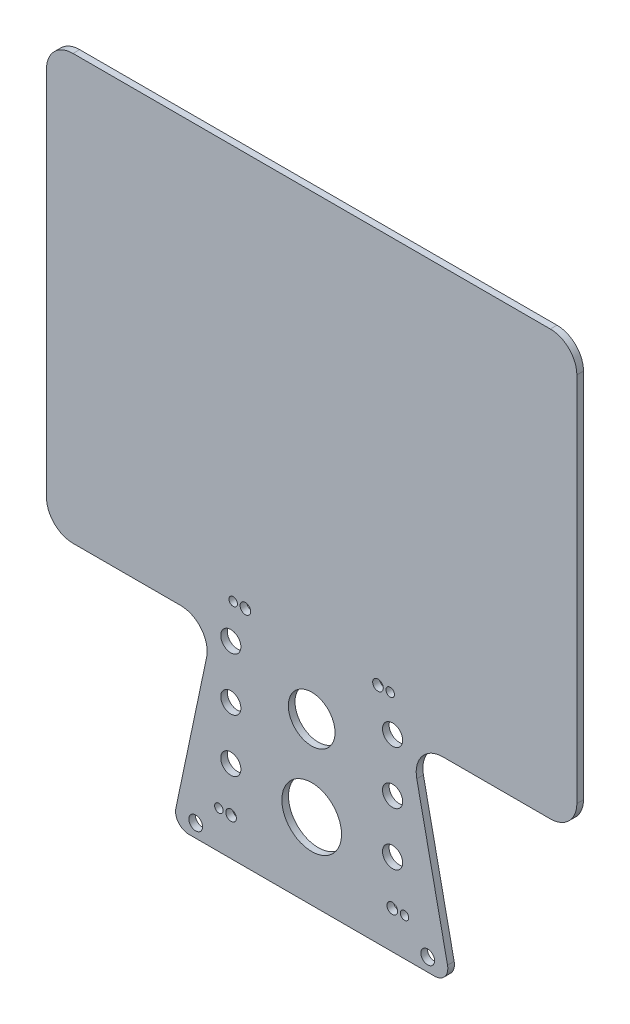
ISO-10303-21;
HEADER;
FILE_DESCRIPTION(('STEP AP214'),'2;1');
FILE_NAME('part.step','',(''),(''),'','','');
FILE_SCHEMA(('AUTOMOTIVE_DESIGN { 1 0 10303 214 1 1 1 1 }'));
ENDSEC;
DATA;
#1=APPLICATION_CONTEXT('core data for automotive mechanical design processes');
#2=APPLICATION_PROTOCOL_DEFINITION('international standard','automotive_design',2000,#1);
#3=PRODUCT_CONTEXT('',#1,'mechanical');
#4=PRODUCT('Part','Part','',(#3));
#5=PRODUCT_RELATED_PRODUCT_CATEGORY('part','',(#4));
#6=PRODUCT_DEFINITION_FORMATION('','',#4);
#7=PRODUCT_DEFINITION_CONTEXT('part definition',#1,'design');
#8=PRODUCT_DEFINITION('design','',#6,#7);
#9=PRODUCT_DEFINITION_SHAPE('','',#8);
#10=(LENGTH_UNIT() NAMED_UNIT(*) SI_UNIT(.MILLI.,.METRE.));
#11=(NAMED_UNIT(*) PLANE_ANGLE_UNIT() SI_UNIT($,.RADIAN.));
#12=(NAMED_UNIT(*) SI_UNIT($,.STERADIAN.) SOLID_ANGLE_UNIT());
#13=UNCERTAINTY_MEASURE_WITH_UNIT(LENGTH_MEASURE(1.E-05),#10,'distance_accuracy_value','');
#14=(GEOMETRIC_REPRESENTATION_CONTEXT(3) GLOBAL_UNCERTAINTY_ASSIGNED_CONTEXT((#13)) GLOBAL_UNIT_ASSIGNED_CONTEXT((#10,
#11,#12)) REPRESENTATION_CONTEXT('',''));
#15=CARTESIAN_POINT('',(0.,0.,0.));
#16=DIRECTION('',(0.,0.,1.));
#17=DIRECTION('',(1.,0.,0.));
#18=AXIS2_PLACEMENT_3D('',#15,#16,#17);
#19=CARTESIAN_POINT('',(25.4,-120.65,3.175));
#20=DIRECTION('',(-0.978549784986749,-0.206010481049842,0.));
#21=DIRECTION('',(0.206010481049842,-0.978549784986749,0.));
#22=AXIS2_PLACEMENT_3D('',#19,#20,#21);
#23=PLANE('',#22);
#24=DIRECTION('',(-0.206010481049842,0.978549784986749,0.));
#25=VECTOR('',#24,1.);
#26=CARTESIAN_POINT('',(25.4,-120.65,0.));
#27=LINE('',#26,#25);
#28=CARTESIAN_POINT('',(23.7877544095439,-112.991833445334,0.));
#29=VERTEX_POINT('',#28);
#30=CARTESIAN_POINT('',(9.05312275985957,-43.002333109333,0.));
#31=VERTEX_POINT('',#30);
#32=EDGE_CURVE('E163',#29,#31,#27,.T.);
#33=ORIENTED_EDGE('',*,*,#32,.T.);
#34=DIRECTION('',(0.,0.,1.));
#35=VECTOR('',#34,1.);
#36=CARTESIAN_POINT('',(9.05312275985957,-43.002333109333,3.175));
#37=LINE('',#36,#35);
#38=CARTESIAN_POINT('',(9.05312275985957,-43.002333109333,3.175));
#39=VERTEX_POINT('',#38);
#40=EDGE_CURVE('E198',#31,#39,#37,.T.);
#41=ORIENTED_EDGE('',*,*,#40,.T.);
#42=DIRECTION('',(-0.206010481049842,0.978549784986749,0.));
#43=VECTOR('',#42,1.);
#44=CARTESIAN_POINT('',(25.4,-120.65,3.175));
#45=LINE('',#44,#43);
#46=CARTESIAN_POINT('',(23.7877544095439,-112.991833445334,3.175));
#47=VERTEX_POINT('',#46);
#48=EDGE_CURVE('E166',#47,#39,#45,.T.);
#49=ORIENTED_EDGE('',*,*,#48,.F.);
#50=DIRECTION('',(0.,0.,-1.));
#51=VECTOR('',#50,1.);
#52=CARTESIAN_POINT('',(23.7877544095439,-112.991833445334,3.175));
#53=LINE('',#52,#51);
#54=EDGE_CURVE('E151',#47,#29,#53,.T.);
#55=ORIENTED_EDGE('',*,*,#54,.T.);
#56=EDGE_LOOP('',(#33,#41,#49,#55));
#57=FACE_BOUND('',#56,.T.);
#58=ADVANCED_FACE('F33',(#57),#23,.F.);
#59=CARTESIAN_POINT('',(-82.55,0.,3.175));
#60=DIRECTION('',(0.978549784986749,-0.206010481049842,0.));
#61=DIRECTION('',(0.206010481049842,0.978549784986749,0.));
#62=AXIS2_PLACEMENT_3D('',#59,#60,#61);
#63=PLANE('',#62);
#64=DIRECTION('',(-0.206010481049842,-0.978549784986749,0.));
#65=VECTOR('',#64,1.);
#66=CARTESIAN_POINT('',(-82.55,0.,3.175));
#67=LINE('',#66,#65);
#68=CARTESIAN_POINT('',(-91.6031227598596,-43.002333109333,3.175));
#69=VERTEX_POINT('',#68);
#70=CARTESIAN_POINT('',(-106.337754409544,-112.991833445334,3.175));
#71=VERTEX_POINT('',#70);
#72=EDGE_CURVE('E376',#69,#71,#67,.T.);
#73=ORIENTED_EDGE('',*,*,#72,.F.);
#74=DIRECTION('',(0.,0.,1.));
#75=VECTOR('',#74,1.);
#76=CARTESIAN_POINT('',(-91.6031227598596,-43.002333109333,3.175));
#77=LINE('',#76,#75);
#78=CARTESIAN_POINT('',(-91.6031227598596,-43.002333109333,0.));
#79=VERTEX_POINT('',#78);
#80=EDGE_CURVE('E206',#69,#79,#77,.F.);
#81=ORIENTED_EDGE('',*,*,#80,.T.);
#82=DIRECTION('',(-0.206010481049842,-0.978549784986749,0.));
#83=VECTOR('',#82,1.);
#84=CARTESIAN_POINT('',(-82.55,0.,0.));
#85=LINE('',#84,#83);
#86=CARTESIAN_POINT('',(-106.337754409544,-112.991833445334,0.));
#87=VERTEX_POINT('',#86);
#88=EDGE_CURVE('E174',#79,#87,#85,.T.);
#89=ORIENTED_EDGE('',*,*,#88,.T.);
#90=DIRECTION('',(0.,0.,-1.));
#91=VECTOR('',#90,1.);
#92=CARTESIAN_POINT('',(-106.337754409544,-112.991833445334,3.175));
#93=LINE('',#92,#91);
#94=EDGE_CURVE('E195',#87,#71,#93,.F.);
#95=ORIENTED_EDGE('',*,*,#94,.T.);
#96=EDGE_LOOP('',(#73,#81,#89,#95));
#97=FACE_BOUND('',#96,.T.);
#98=ADVANCED_FACE('F425',(#97),#63,.F.);
#99=CARTESIAN_POINT('',(-107.95,-120.65,3.175));
#100=DIRECTION('',(0.,1.,0.));
#101=DIRECTION('',(0.,0.,1.));
#102=AXIS2_PLACEMENT_3D('',#99,#100,#101);
#103=PLANE('',#102);
#104=DIRECTION('',(1.,0.,0.));
#105=VECTOR('',#104,1.);
#106=CARTESIAN_POINT('',(-107.95,-120.65,0.));
#107=LINE('',#106,#105);
#108=CARTESIAN_POINT('',(-100.123963274878,-120.65,0.));
#109=VERTEX_POINT('',#108);
#110=CARTESIAN_POINT('',(17.573963274878,-120.65,0.));
#111=VERTEX_POINT('',#110);
#112=EDGE_CURVE('E177',#109,#111,#107,.T.);
#113=ORIENTED_EDGE('',*,*,#112,.T.);
#114=DIRECTION('',(0.,0.,-1.));
#115=VECTOR('',#114,1.);
#116=CARTESIAN_POINT('',(17.573963274878,-120.65,3.175));
#117=LINE('',#116,#115);
#118=CARTESIAN_POINT('',(17.573963274878,-120.65,3.175));
#119=VERTEX_POINT('',#118);
#120=EDGE_CURVE('E152',#111,#119,#117,.F.);
#121=ORIENTED_EDGE('',*,*,#120,.T.);
#122=DIRECTION('',(1.,0.,0.));
#123=VECTOR('',#122,1.);
#124=CARTESIAN_POINT('',(-107.95,-120.65,3.175));
#125=LINE('',#124,#123);
#126=CARTESIAN_POINT('',(-100.123963274878,-120.65,3.175));
#127=VERTEX_POINT('',#126);
#128=EDGE_CURVE('E167',#127,#119,#125,.T.);
#129=ORIENTED_EDGE('',*,*,#128,.F.);
#130=DIRECTION('',(0.,0.,-1.));
#131=VECTOR('',#130,1.);
#132=CARTESIAN_POINT('',(-100.123963274878,-120.65,3.175));
#133=LINE('',#132,#131);
#134=EDGE_CURVE('E156',#127,#109,#133,.T.);
#135=ORIENTED_EDGE('',*,*,#134,.T.);
#136=EDGE_LOOP('',(#113,#121,#129,#135));
#137=FACE_BOUND('',#136,.T.);
#138=ADVANCED_FACE('F383',(#137),#103,.F.);
#139=CARTESIAN_POINT('',(0.,0.,3.175));
#140=DIRECTION('',(0.,0.,1.));
#141=DIRECTION('',(1.,0.,0.));
#142=AXIS2_PLACEMENT_3D('',#139,#140,#141);
#143=PLANE('',#142);
#144=DIRECTION('',(-1.,0.,0.));
#145=VECTOR('',#144,1.);
#146=CARTESIAN_POINT('',(-168.275,175.514,3.175));
#147=LINE('',#146,#145);
#148=CARTESIAN_POINT('',(73.0249999999999,175.514,3.175));
#149=VERTEX_POINT('',#148);
#150=CARTESIAN_POINT('',(-155.575,175.514,3.175));
#151=VERTEX_POINT('',#150);
#152=EDGE_CURVE('E260',#149,#151,#147,.T.);
#153=ORIENTED_EDGE('',*,*,#152,.T.);
#154=CARTESIAN_POINT('',(-155.575,162.814,3.17499999999998));
#155=DIRECTION('',(0.,0.,1.));
#156=DIRECTION('',(1.,0.,0.));
#157=AXIS2_PLACEMENT_3D('',#154,#155,#156);
#158=CIRCLE('',#157,12.7);
#159=CARTESIAN_POINT('',(-168.275,162.814,3.175));
#160=VERTEX_POINT('',#159);
#161=EDGE_CURVE('E226',#151,#160,#158,.T.);
#162=ORIENTED_EDGE('',*,*,#161,.T.);
#163=DIRECTION('',(0.,-1.,0.));
#164=VECTOR('',#163,1.);
#165=CARTESIAN_POINT('',(-168.275,-27.686,3.175));
#166=LINE('',#165,#164);
#167=CARTESIAN_POINT('',(-168.275,-14.986,3.175));
#168=VERTEX_POINT('',#167);
#169=EDGE_CURVE('E267',#160,#168,#166,.T.);
#170=ORIENTED_EDGE('',*,*,#169,.T.);
#171=CARTESIAN_POINT('',(-155.575,-14.986,3.17499999999998));
#172=DIRECTION('',(0.,0.,1.));
#173=DIRECTION('',(1.,0.,0.));
#174=AXIS2_PLACEMENT_3D('',#171,#172,#173);
#175=CIRCLE('',#174,12.7);
#176=CARTESIAN_POINT('',(-155.575,-27.686,3.175));
#177=VERTEX_POINT('',#176);
#178=EDGE_CURVE('E220',#168,#177,#175,.T.);
#179=ORIENTED_EDGE('',*,*,#178,.T.);
#180=DIRECTION('',(1.,0.,0.));
#181=VECTOR('',#180,1.);
#182=CARTESIAN_POINT('',(-88.3786315789474,-27.686,3.175));
#183=LINE('',#182,#181);
#184=CARTESIAN_POINT('',(-104.030705029191,-27.686,3.175));
#185=VERTEX_POINT('',#184);
#186=EDGE_CURVE('E270',#177,#185,#183,.T.);
#187=ORIENTED_EDGE('',*,*,#186,.T.);
#188=CARTESIAN_POINT('',(-104.030705029191,-40.386,3.17499999999998));
#189=DIRECTION('',(0.,0.,1.));
#190=DIRECTION('',(1.,0.,0.));
#191=AXIS2_PLACEMENT_3D('',#188,#189,#190);
#192=CIRCLE('',#191,12.7);
#193=EDGE_CURVE('E211',#185,#69,#192,.F.);
#194=ORIENTED_EDGE('',*,*,#193,.T.);
#195=ORIENTED_EDGE('',*,*,#72,.T.);
#196=CARTESIAN_POINT('',(-100.123963274878,-114.3,3.175));
#197=DIRECTION('',(0.,0.,1.));
#198=DIRECTION('',(1.,0.,0.));
#199=AXIS2_PLACEMENT_3D('',#196,#197,#198);
#200=CIRCLE('',#199,6.35);
#201=EDGE_CURVE('E191',#71,#127,#200,.T.);
#202=ORIENTED_EDGE('',*,*,#201,.T.);
#203=ORIENTED_EDGE('',*,*,#128,.T.);
#204=CARTESIAN_POINT('',(17.573963274878,-114.3,3.175));
#205=DIRECTION('',(0.,0.,1.));
#206=DIRECTION('',(1.,0.,0.));
#207=AXIS2_PLACEMENT_3D('',#204,#205,#206);
#208=CIRCLE('',#207,6.35);
#209=EDGE_CURVE('E193',#119,#47,#208,.T.);
#210=ORIENTED_EDGE('',*,*,#209,.T.);
#211=ORIENTED_EDGE('',*,*,#48,.T.);
#212=CARTESIAN_POINT('',(21.4807050291913,-40.386,3.175));
#213=DIRECTION('',(0.,0.,1.));
#214=DIRECTION('',(1.,0.,0.));
#215=AXIS2_PLACEMENT_3D('',#212,#213,#214);
#216=CIRCLE('',#215,12.7);
#217=CARTESIAN_POINT('',(21.4807050291913,-27.686,3.175));
#218=VERTEX_POINT('',#217);
#219=EDGE_CURVE('E208',#39,#218,#216,.F.);
#220=ORIENTED_EDGE('',*,*,#219,.T.);
#221=DIRECTION('',(1.,0.,0.));
#222=VECTOR('',#221,1.);
#223=CARTESIAN_POINT('',(5.82863157894736,-27.686,3.175));
#224=LINE('',#223,#222);
#225=CARTESIAN_POINT('',(73.025,-27.686,3.175));
#226=VERTEX_POINT('',#225);
#227=EDGE_CURVE('E249',#218,#226,#224,.T.);
#228=ORIENTED_EDGE('',*,*,#227,.T.);
#229=CARTESIAN_POINT('',(73.025,-14.986,3.17499999999998));
#230=DIRECTION('',(0.,0.,1.));
#231=DIRECTION('',(1.,0.,0.));
#232=AXIS2_PLACEMENT_3D('',#229,#230,#231);
#233=CIRCLE('',#232,12.7);
#234=CARTESIAN_POINT('',(85.7250000000001,-14.986,3.175));
#235=VERTEX_POINT('',#234);
#236=EDGE_CURVE('E222',#226,#235,#233,.T.);
#237=ORIENTED_EDGE('',*,*,#236,.T.);
#238=DIRECTION('',(0.,1.,0.));
#239=VECTOR('',#238,1.);
#240=CARTESIAN_POINT('',(85.725,175.514,3.175));
#241=LINE('',#240,#239);
#242=CARTESIAN_POINT('',(85.725,162.814,3.175));
#243=VERTEX_POINT('',#242);
#244=EDGE_CURVE('E258',#235,#243,#241,.T.);
#245=ORIENTED_EDGE('',*,*,#244,.T.);
#246=CARTESIAN_POINT('',(73.025,162.814,3.17499999999998));
#247=DIRECTION('',(0.,0.,1.));
#248=DIRECTION('',(1.,0.,0.));
#249=AXIS2_PLACEMENT_3D('',#246,#247,#248);
#250=CIRCLE('',#249,12.7);
#251=EDGE_CURVE('E224',#243,#149,#250,.T.);
#252=ORIENTED_EDGE('',*,*,#251,.T.);
#253=EDGE_LOOP('',(#153,#162,#170,#179,#187,#194,#195,#202,#203,#210,#211,#220,#228,#237,#245,#252));
#254=FACE_BOUND('',#253,.T.);
#255=CARTESIAN_POINT('',(-2.54,-30.48,3.175));
#256=DIRECTION('',(0.,0.,1.));
#257=DIRECTION('',(1.,0.,0.));
#258=AXIS2_PLACEMENT_3D('',#255,#256,#257);
#259=CIRCLE('',#258,4.826);
#260=CARTESIAN_POINT('',(2.286,-30.48,3.175));
#261=VERTEX_POINT('',#260);
#262=EDGE_CURVE('E276',#261,#261,#259,.T.);
#263=ORIENTED_EDGE('',*,*,#262,.F.);
#264=EDGE_LOOP('',(#263));
#265=FACE_BOUND('',#264,.T.);
#266=CARTESIAN_POINT('',(-2.53999999999999,-55.88,3.175));
#267=DIRECTION('',(0.,0.,1.));
#268=DIRECTION('',(1.,0.,0.));
#269=AXIS2_PLACEMENT_3D('',#266,#267,#268);
#270=CIRCLE('',#269,4.826);
#271=CARTESIAN_POINT('',(2.28600000000001,-55.88,3.175));
#272=VERTEX_POINT('',#271);
#273=EDGE_CURVE('E275',#272,#272,#270,.T.);
#274=ORIENTED_EDGE('',*,*,#273,.F.);
#275=EDGE_LOOP('',(#274));
#276=FACE_BOUND('',#275,.T.);
#277=CARTESIAN_POINT('',(-2.54,-81.28,3.175));
#278=DIRECTION('',(0.,0.,1.));
#279=DIRECTION('',(1.,0.,0.));
#280=AXIS2_PLACEMENT_3D('',#277,#278,#279);
#281=CIRCLE('',#280,4.82599999999999);
#282=CARTESIAN_POINT('',(2.28599999999999,-81.28,3.175));
#283=VERTEX_POINT('',#282);
#284=EDGE_CURVE('E282',#283,#283,#281,.T.);
#285=ORIENTED_EDGE('',*,*,#284,.F.);
#286=EDGE_LOOP('',(#285));
#287=FACE_BOUND('',#286,.T.);
#288=CARTESIAN_POINT('',(-80.01,-81.28,3.175));
#289=DIRECTION('',(0.,0.,1.));
#290=DIRECTION('',(1.,0.,0.));
#291=AXIS2_PLACEMENT_3D('',#288,#289,#290);
#292=CIRCLE('',#291,4.82599999999999);
#293=CARTESIAN_POINT('',(-75.184,-81.28,3.175));
#294=VERTEX_POINT('',#293);
#295=EDGE_CURVE('E288',#294,#294,#292,.T.);
#296=ORIENTED_EDGE('',*,*,#295,.F.);
#297=EDGE_LOOP('',(#296));
#298=FACE_BOUND('',#297,.T.);
#299=CARTESIAN_POINT('',(-80.01,-55.88,3.175));
#300=DIRECTION('',(0.,0.,1.));
#301=DIRECTION('',(1.,0.,0.));
#302=AXIS2_PLACEMENT_3D('',#299,#300,#301);
#303=CIRCLE('',#302,4.826);
#304=CARTESIAN_POINT('',(-75.184,-55.88,3.175));
#305=VERTEX_POINT('',#304);
#306=EDGE_CURVE('E294',#305,#305,#303,.T.);
#307=ORIENTED_EDGE('',*,*,#306,.F.);
#308=EDGE_LOOP('',(#307));
#309=FACE_BOUND('',#308,.T.);
#310=CARTESIAN_POINT('',(-80.01,-30.48,3.175));
#311=DIRECTION('',(0.,0.,1.));
#312=DIRECTION('',(1.,0.,0.));
#313=AXIS2_PLACEMENT_3D('',#310,#311,#312);
#314=CIRCLE('',#313,4.82599999999999);
#315=CARTESIAN_POINT('',(-75.184,-30.48,3.175));
#316=VERTEX_POINT('',#315);
#317=EDGE_CURVE('E300',#316,#316,#314,.T.);
#318=ORIENTED_EDGE('',*,*,#317,.F.);
#319=EDGE_LOOP('',(#318));
#320=FACE_BOUND('',#319,.T.);
#321=CARTESIAN_POINT('',(3.17500000000001,-102.616,3.175));
#322=DIRECTION('',(0.,0.,1.));
#323=DIRECTION('',(1.,0.,0.));
#324=AXIS2_PLACEMENT_3D('',#321,#322,#323);
#325=CIRCLE('',#324,2.03200000000001);
#326=CARTESIAN_POINT('',(5.20700000000002,-102.616,3.175));
#327=VERTEX_POINT('',#326);
#328=EDGE_CURVE('E306',#327,#327,#325,.T.);
#329=ORIENTED_EDGE('',*,*,#328,.F.);
#330=EDGE_LOOP('',(#329));
#331=FACE_BOUND('',#330,.T.);
#332=CARTESIAN_POINT('',(-85.725,-102.616,3.175));
#333=DIRECTION('',(0.,0.,1.));
#334=DIRECTION('',(1.,0.,0.));
#335=AXIS2_PLACEMENT_3D('',#332,#333,#334);
#336=CIRCLE('',#335,2.03200000000001);
#337=CARTESIAN_POINT('',(-83.693,-102.616,3.175));
#338=VERTEX_POINT('',#337);
#339=EDGE_CURVE('E312',#338,#338,#336,.T.);
#340=ORIENTED_EDGE('',*,*,#339,.F.);
#341=EDGE_LOOP('',(#340));
#342=FACE_BOUND('',#341,.T.);
#343=CARTESIAN_POINT('',(-79.883,-102.616,3.175));
#344=DIRECTION('',(0.,0.,1.));
#345=DIRECTION('',(1.,0.,0.));
#346=AXIS2_PLACEMENT_3D('',#343,#344,#345);
#347=CIRCLE('',#346,2.53999999999999);
#348=CARTESIAN_POINT('',(-77.343,-102.616,3.175));
#349=VERTEX_POINT('',#348);
#350=EDGE_CURVE('E318',#349,#349,#347,.T.);
#351=ORIENTED_EDGE('',*,*,#350,.F.);
#352=EDGE_LOOP('',(#351));
#353=FACE_BOUND('',#352,.T.);
#354=CARTESIAN_POINT('',(-2.66699999999999,-102.616,3.175));
#355=DIRECTION('',(0.,0.,1.));
#356=DIRECTION('',(1.,0.,0.));
#357=AXIS2_PLACEMENT_3D('',#354,#355,#356);
#358=CIRCLE('',#357,2.54);
#359=CARTESIAN_POINT('',(-0.126999999999993,-102.616,3.175));
#360=VERTEX_POINT('',#359);
#361=EDGE_CURVE('E324',#360,#360,#358,.T.);
#362=ORIENTED_EDGE('',*,*,#361,.F.);
#363=EDGE_LOOP('',(#362));
#364=FACE_BOUND('',#363,.T.);
#365=CARTESIAN_POINT('',(-41.275,-43.434,3.175));
#366=DIRECTION('',(0.,0.,1.));
#367=DIRECTION('',(1.,0.,0.));
#368=AXIS2_PLACEMENT_3D('',#365,#366,#367);
#369=CIRCLE('',#368,11.176);
#370=CARTESIAN_POINT('',(-30.099,-43.434,3.175));
#371=VERTEX_POINT('',#370);
#372=EDGE_CURVE('E330',#371,#371,#369,.T.);
#373=ORIENTED_EDGE('',*,*,#372,.F.);
#374=EDGE_LOOP('',(#373));
#375=FACE_BOUND('',#374,.T.);
#376=CARTESIAN_POINT('',(-41.275,-84.074,3.175));
#377=DIRECTION('',(0.,0.,1.));
#378=DIRECTION('',(1.,0.,0.));
#379=AXIS2_PLACEMENT_3D('',#376,#377,#378);
#380=CIRCLE('',#379,14.2875);
#381=CARTESIAN_POINT('',(-26.9875,-84.074,3.175));
#382=VERTEX_POINT('',#381);
#383=EDGE_CURVE('E336',#382,#382,#380,.T.);
#384=ORIENTED_EDGE('',*,*,#383,.F.);
#385=EDGE_LOOP('',(#384));
#386=FACE_BOUND('',#385,.T.);
#387=CARTESIAN_POINT('',(-78.867,-13.462,3.175));
#388=DIRECTION('',(0.,0.,-1.));
#389=DIRECTION('',(-1.,0.,0.));
#390=AXIS2_PLACEMENT_3D('',#387,#388,#389);
#391=CIRCLE('',#390,2.03200000000001);
#392=CARTESIAN_POINT('',(-80.899,-13.462,3.175));
#393=VERTEX_POINT('',#392);
#394=EDGE_CURVE('E345',#393,#393,#391,.T.);
#395=ORIENTED_EDGE('',*,*,#394,.T.);
#396=EDGE_LOOP('',(#395));
#397=FACE_BOUND('',#396,.T.);
#398=CARTESIAN_POINT('',(-3.683,-13.462,3.175));
#399=DIRECTION('',(0.,0.,-1.));
#400=DIRECTION('',(-1.,0.,0.));
#401=AXIS2_PLACEMENT_3D('',#398,#399,#400);
#402=CIRCLE('',#401,2.032);
#403=CARTESIAN_POINT('',(-5.715,-13.462,3.175));
#404=VERTEX_POINT('',#403);
#405=EDGE_CURVE('E351',#404,#404,#402,.T.);
#406=ORIENTED_EDGE('',*,*,#405,.T.);
#407=EDGE_LOOP('',(#406));
#408=FACE_BOUND('',#407,.T.);
#409=CARTESIAN_POINT('',(-73.025,-13.462,3.175));
#410=DIRECTION('',(0.,0.,-1.));
#411=DIRECTION('',(-1.,0.,0.));
#412=AXIS2_PLACEMENT_3D('',#409,#410,#411);
#413=CIRCLE('',#412,2.54);
#414=CARTESIAN_POINT('',(-75.565,-13.462,3.175));
#415=VERTEX_POINT('',#414);
#416=EDGE_CURVE('E357',#415,#415,#413,.T.);
#417=ORIENTED_EDGE('',*,*,#416,.T.);
#418=EDGE_LOOP('',(#417));
#419=FACE_BOUND('',#418,.T.);
#420=CARTESIAN_POINT('',(-9.525,-13.462,3.175));
#421=DIRECTION('',(0.,0.,-1.));
#422=DIRECTION('',(-1.,0.,0.));
#423=AXIS2_PLACEMENT_3D('',#420,#421,#422);
#424=CIRCLE('',#423,2.54);
#425=CARTESIAN_POINT('',(-12.065,-13.462,3.175));
#426=VERTEX_POINT('',#425);
#427=EDGE_CURVE('E363',#426,#426,#424,.T.);
#428=ORIENTED_EDGE('',*,*,#427,.T.);
#429=EDGE_LOOP('',(#428));
#430=FACE_BOUND('',#429,.T.);
#431=CARTESIAN_POINT('',(-96.8375,-114.3,3.175));
#432=DIRECTION('',(0.,0.,-1.));
#433=DIRECTION('',(-1.,0.,0.));
#434=AXIS2_PLACEMENT_3D('',#431,#432,#433);
#435=CIRCLE('',#434,3.302);
#436=CARTESIAN_POINT('',(-100.1395,-114.3,3.175));
#437=VERTEX_POINT('',#436);
#438=EDGE_CURVE('E369',#437,#437,#435,.T.);
#439=ORIENTED_EDGE('',*,*,#438,.T.);
#440=EDGE_LOOP('',(#439));
#441=FACE_BOUND('',#440,.T.);
#442=CARTESIAN_POINT('',(14.2875,-114.3,3.175));
#443=DIRECTION('',(0.,0.,-1.));
#444=DIRECTION('',(-1.,0.,0.));
#445=AXIS2_PLACEMENT_3D('',#442,#443,#444);
#446=CIRCLE('',#445,3.302);
#447=CARTESIAN_POINT('',(10.9855,-114.3,3.175));
#448=VERTEX_POINT('',#447);
#449=EDGE_CURVE('E175',#448,#448,#446,.T.);
#450=ORIENTED_EDGE('',*,*,#449,.T.);
#451=EDGE_LOOP('',(#450));
#452=FACE_BOUND('',#451,.T.);
#453=ADVANCED_FACE('F255',(#254,#265,#276,#287,#298,#309,#320,#331,#342,#353,#364,#375,#386,
#397,#408,#419,#430,#441,#452),#143,.T.);
#454=CARTESIAN_POINT('',(0.,0.,0.));
#455=DIRECTION('',(0.,0.,1.));
#456=DIRECTION('',(1.,0.,0.));
#457=AXIS2_PLACEMENT_3D('',#454,#455,#456);
#458=PLANE('',#457);
#459=DIRECTION('',(0.,1.,0.));
#460=VECTOR('',#459,1.);
#461=CARTESIAN_POINT('',(-168.275,-27.686,0.));
#462=LINE('',#461,#460);
#463=CARTESIAN_POINT('',(-168.275,-14.986,0.));
#464=VERTEX_POINT('',#463);
#465=CARTESIAN_POINT('',(-168.275,162.814,0.));
#466=VERTEX_POINT('',#465);
#467=EDGE_CURVE('E402',#464,#466,#462,.T.);
#468=ORIENTED_EDGE('',*,*,#467,.T.);
#469=CARTESIAN_POINT('',(-155.575,162.814,0.));
#470=DIRECTION('',(0.,0.,1.));
#471=DIRECTION('',(1.,0.,0.));
#472=AXIS2_PLACEMENT_3D('',#469,#470,#471);
#473=CIRCLE('',#472,12.7);
#474=CARTESIAN_POINT('',(-155.575,175.514,0.));
#475=VERTEX_POINT('',#474);
#476=EDGE_CURVE('E238',#466,#475,#473,.F.);
#477=ORIENTED_EDGE('',*,*,#476,.T.);
#478=DIRECTION('',(1.,0.,0.));
#479=VECTOR('',#478,1.);
#480=CARTESIAN_POINT('',(-168.275,175.514,0.));
#481=LINE('',#480,#479);
#482=CARTESIAN_POINT('',(73.0249999999999,175.514,0.));
#483=VERTEX_POINT('',#482);
#484=EDGE_CURVE('E403',#475,#483,#481,.T.);
#485=ORIENTED_EDGE('',*,*,#484,.T.);
#486=CARTESIAN_POINT('',(73.025,162.814,0.));
#487=DIRECTION('',(0.,0.,1.));
#488=DIRECTION('',(1.,0.,0.));
#489=AXIS2_PLACEMENT_3D('',#486,#487,#488);
#490=CIRCLE('',#489,12.7);
#491=CARTESIAN_POINT('',(85.725,162.814,0.));
#492=VERTEX_POINT('',#491);
#493=EDGE_CURVE('E236',#483,#492,#490,.F.);
#494=ORIENTED_EDGE('',*,*,#493,.T.);
#495=DIRECTION('',(0.,-1.,0.));
#496=VECTOR('',#495,1.);
#497=CARTESIAN_POINT('',(85.725,175.514,0.));
#498=LINE('',#497,#496);
#499=CARTESIAN_POINT('',(85.7250000000001,-14.986,0.));
#500=VERTEX_POINT('',#499);
#501=EDGE_CURVE('E407',#492,#500,#498,.T.);
#502=ORIENTED_EDGE('',*,*,#501,.T.);
#503=CARTESIAN_POINT('',(73.025,-14.986,0.));
#504=DIRECTION('',(0.,0.,1.));
#505=DIRECTION('',(1.,0.,0.));
#506=AXIS2_PLACEMENT_3D('',#503,#504,#505);
#507=CIRCLE('',#506,12.7);
#508=CARTESIAN_POINT('',(73.025,-27.686,0.));
#509=VERTEX_POINT('',#508);
#510=EDGE_CURVE('E48',#500,#509,#507,.F.);
#511=ORIENTED_EDGE('',*,*,#510,.T.);
#512=DIRECTION('',(-1.,0.,0.));
#513=VECTOR('',#512,1.);
#514=CARTESIAN_POINT('',(5.82863157894736,-27.686,0.));
#515=LINE('',#514,#513);
#516=CARTESIAN_POINT('',(21.4807050291913,-27.686,0.));
#517=VERTEX_POINT('',#516);
#518=EDGE_CURVE('E251',#509,#517,#515,.T.);
#519=ORIENTED_EDGE('',*,*,#518,.T.);
#520=CARTESIAN_POINT('',(21.4807050291913,-40.386,0.));
#521=DIRECTION('',(0.,0.,1.));
#522=DIRECTION('',(1.,0.,0.));
#523=AXIS2_PLACEMENT_3D('',#520,#521,#522);
#524=CIRCLE('',#523,12.7);
#525=EDGE_CURVE('E173',#517,#31,#524,.T.);
#526=ORIENTED_EDGE('',*,*,#525,.T.);
#527=ORIENTED_EDGE('',*,*,#32,.F.);
#528=CARTESIAN_POINT('',(17.573963274878,-114.3,0.));
#529=DIRECTION('',(0.,0.,1.));
#530=DIRECTION('',(1.,0.,0.));
#531=AXIS2_PLACEMENT_3D('',#528,#529,#530);
#532=CIRCLE('',#531,6.35);
#533=EDGE_CURVE('E147',#29,#111,#532,.F.);
#534=ORIENTED_EDGE('',*,*,#533,.T.);
#535=ORIENTED_EDGE('',*,*,#112,.F.);
#536=CARTESIAN_POINT('',(-100.123963274878,-114.3,0.));
#537=DIRECTION('',(0.,0.,1.));
#538=DIRECTION('',(1.,0.,0.));
#539=AXIS2_PLACEMENT_3D('',#536,#537,#538);
#540=CIRCLE('',#539,6.35);
#541=EDGE_CURVE('E157',#109,#87,#540,.F.);
#542=ORIENTED_EDGE('',*,*,#541,.T.);
#543=ORIENTED_EDGE('',*,*,#88,.F.);
#544=CARTESIAN_POINT('',(-104.030705029191,-40.386,0.));
#545=DIRECTION('',(0.,0.,1.));
#546=DIRECTION('',(1.,0.,0.));
#547=AXIS2_PLACEMENT_3D('',#544,#545,#546);
#548=CIRCLE('',#547,12.7);
#549=CARTESIAN_POINT('',(-104.030705029191,-27.686,0.));
#550=VERTEX_POINT('',#549);
#551=EDGE_CURVE('E213',#79,#550,#548,.T.);
#552=ORIENTED_EDGE('',*,*,#551,.T.);
#553=DIRECTION('',(-1.,0.,0.));
#554=VECTOR('',#553,1.);
#555=CARTESIAN_POINT('',(-88.3786315789474,-27.686,0.));
#556=LINE('',#555,#554);
#557=CARTESIAN_POINT('',(-155.575,-27.686,0.));
#558=VERTEX_POINT('',#557);
#559=EDGE_CURVE('E263',#550,#558,#556,.T.);
#560=ORIENTED_EDGE('',*,*,#559,.T.);
#561=CARTESIAN_POINT('',(-155.575,-14.986,0.));
#562=DIRECTION('',(0.,0.,1.));
#563=DIRECTION('',(1.,0.,0.));
#564=AXIS2_PLACEMENT_3D('',#561,#562,#563);
#565=CIRCLE('',#564,12.7);
#566=EDGE_CURVE('E233',#558,#464,#565,.F.);
#567=ORIENTED_EDGE('',*,*,#566,.T.);
#568=EDGE_LOOP('',(#468,#477,#485,#494,#502,#511,#519,#526,#527,#534,#535,#542,#543,#552,#560,#567));
#569=FACE_BOUND('',#568,.T.);
#570=CARTESIAN_POINT('',(-2.54,-30.48,0.));
#571=DIRECTION('',(0.,0.,1.));
#572=DIRECTION('',(1.,0.,0.));
#573=AXIS2_PLACEMENT_3D('',#570,#571,#572);
#574=CIRCLE('',#573,4.826);
#575=CARTESIAN_POINT('',(2.286,-30.48,0.));
#576=VERTEX_POINT('',#575);
#577=EDGE_CURVE('E272',#576,#576,#574,.T.);
#578=ORIENTED_EDGE('',*,*,#577,.T.);
#579=EDGE_LOOP('',(#578));
#580=FACE_BOUND('',#579,.T.);
#581=CARTESIAN_POINT('',(-2.53999999999999,-55.88,0.));
#582=DIRECTION('',(0.,0.,1.));
#583=DIRECTION('',(1.,0.,0.));
#584=AXIS2_PLACEMENT_3D('',#581,#582,#583);
#585=CIRCLE('',#584,4.826);
#586=CARTESIAN_POINT('',(2.28600000000001,-55.88,0.));
#587=VERTEX_POINT('',#586);
#588=EDGE_CURVE('E279',#587,#587,#585,.T.);
#589=ORIENTED_EDGE('',*,*,#588,.T.);
#590=EDGE_LOOP('',(#589));
#591=FACE_BOUND('',#590,.T.);
#592=CARTESIAN_POINT('',(-2.54,-81.28,0.));
#593=DIRECTION('',(0.,0.,1.));
#594=DIRECTION('',(1.,0.,0.));
#595=AXIS2_PLACEMENT_3D('',#592,#593,#594);
#596=CIRCLE('',#595,4.82599999999999);
#597=CARTESIAN_POINT('',(2.28599999999999,-81.28,0.));
#598=VERTEX_POINT('',#597);
#599=EDGE_CURVE('E285',#598,#598,#596,.T.);
#600=ORIENTED_EDGE('',*,*,#599,.T.);
#601=EDGE_LOOP('',(#600));
#602=FACE_BOUND('',#601,.T.);
#603=CARTESIAN_POINT('',(-80.01,-81.28,0.));
#604=DIRECTION('',(0.,0.,1.));
#605=DIRECTION('',(1.,0.,0.));
#606=AXIS2_PLACEMENT_3D('',#603,#604,#605);
#607=CIRCLE('',#606,4.82599999999999);
#608=CARTESIAN_POINT('',(-75.184,-81.28,0.));
#609=VERTEX_POINT('',#608);
#610=EDGE_CURVE('E291',#609,#609,#607,.T.);
#611=ORIENTED_EDGE('',*,*,#610,.T.);
#612=EDGE_LOOP('',(#611));
#613=FACE_BOUND('',#612,.T.);
#614=CARTESIAN_POINT('',(-80.01,-55.88,0.));
#615=DIRECTION('',(0.,0.,1.));
#616=DIRECTION('',(1.,0.,0.));
#617=AXIS2_PLACEMENT_3D('',#614,#615,#616);
#618=CIRCLE('',#617,4.826);
#619=CARTESIAN_POINT('',(-75.184,-55.88,0.));
#620=VERTEX_POINT('',#619);
#621=EDGE_CURVE('E297',#620,#620,#618,.T.);
#622=ORIENTED_EDGE('',*,*,#621,.T.);
#623=EDGE_LOOP('',(#622));
#624=FACE_BOUND('',#623,.T.);
#625=CARTESIAN_POINT('',(-80.01,-30.48,0.));
#626=DIRECTION('',(0.,0.,1.));
#627=DIRECTION('',(1.,0.,0.));
#628=AXIS2_PLACEMENT_3D('',#625,#626,#627);
#629=CIRCLE('',#628,4.82599999999999);
#630=CARTESIAN_POINT('',(-75.184,-30.48,0.));
#631=VERTEX_POINT('',#630);
#632=EDGE_CURVE('E303',#631,#631,#629,.T.);
#633=ORIENTED_EDGE('',*,*,#632,.T.);
#634=EDGE_LOOP('',(#633));
#635=FACE_BOUND('',#634,.T.);
#636=CARTESIAN_POINT('',(3.17500000000001,-102.616,0.));
#637=DIRECTION('',(0.,0.,1.));
#638=DIRECTION('',(1.,0.,0.));
#639=AXIS2_PLACEMENT_3D('',#636,#637,#638);
#640=CIRCLE('',#639,2.03200000000001);
#641=CARTESIAN_POINT('',(5.20700000000002,-102.616,0.));
#642=VERTEX_POINT('',#641);
#643=EDGE_CURVE('E309',#642,#642,#640,.T.);
#644=ORIENTED_EDGE('',*,*,#643,.T.);
#645=EDGE_LOOP('',(#644));
#646=FACE_BOUND('',#645,.T.);
#647=CARTESIAN_POINT('',(-85.725,-102.616,0.));
#648=DIRECTION('',(0.,0.,1.));
#649=DIRECTION('',(1.,0.,0.));
#650=AXIS2_PLACEMENT_3D('',#647,#648,#649);
#651=CIRCLE('',#650,2.03200000000001);
#652=CARTESIAN_POINT('',(-83.693,-102.616,0.));
#653=VERTEX_POINT('',#652);
#654=EDGE_CURVE('E315',#653,#653,#651,.T.);
#655=ORIENTED_EDGE('',*,*,#654,.T.);
#656=EDGE_LOOP('',(#655));
#657=FACE_BOUND('',#656,.T.);
#658=CARTESIAN_POINT('',(-79.883,-102.616,0.));
#659=DIRECTION('',(0.,0.,1.));
#660=DIRECTION('',(1.,0.,0.));
#661=AXIS2_PLACEMENT_3D('',#658,#659,#660);
#662=CIRCLE('',#661,2.53999999999999);
#663=CARTESIAN_POINT('',(-77.343,-102.616,0.));
#664=VERTEX_POINT('',#663);
#665=EDGE_CURVE('E321',#664,#664,#662,.T.);
#666=ORIENTED_EDGE('',*,*,#665,.T.);
#667=EDGE_LOOP('',(#666));
#668=FACE_BOUND('',#667,.T.);
#669=CARTESIAN_POINT('',(-2.66699999999999,-102.616,0.));
#670=DIRECTION('',(0.,0.,1.));
#671=DIRECTION('',(1.,0.,0.));
#672=AXIS2_PLACEMENT_3D('',#669,#670,#671);
#673=CIRCLE('',#672,2.54);
#674=CARTESIAN_POINT('',(-0.126999999999993,-102.616,0.));
#675=VERTEX_POINT('',#674);
#676=EDGE_CURVE('E327',#675,#675,#673,.T.);
#677=ORIENTED_EDGE('',*,*,#676,.T.);
#678=EDGE_LOOP('',(#677));
#679=FACE_BOUND('',#678,.T.);
#680=CARTESIAN_POINT('',(-41.275,-43.434,0.));
#681=DIRECTION('',(0.,0.,1.));
#682=DIRECTION('',(1.,0.,0.));
#683=AXIS2_PLACEMENT_3D('',#680,#681,#682);
#684=CIRCLE('',#683,11.176);
#685=CARTESIAN_POINT('',(-30.099,-43.434,0.));
#686=VERTEX_POINT('',#685);
#687=EDGE_CURVE('E333',#686,#686,#684,.T.);
#688=ORIENTED_EDGE('',*,*,#687,.T.);
#689=EDGE_LOOP('',(#688));
#690=FACE_BOUND('',#689,.T.);
#691=CARTESIAN_POINT('',(-41.275,-84.074,0.));
#692=DIRECTION('',(0.,0.,1.));
#693=DIRECTION('',(1.,0.,0.));
#694=AXIS2_PLACEMENT_3D('',#691,#692,#693);
#695=CIRCLE('',#694,14.2875);
#696=CARTESIAN_POINT('',(-26.9875,-84.074,0.));
#697=VERTEX_POINT('',#696);
#698=EDGE_CURVE('E339',#697,#697,#695,.T.);
#699=ORIENTED_EDGE('',*,*,#698,.T.);
#700=EDGE_LOOP('',(#699));
#701=FACE_BOUND('',#700,.T.);
#702=CARTESIAN_POINT('',(-78.867,-13.462,0.));
#703=DIRECTION('',(0.,0.,-1.));
#704=DIRECTION('',(-1.,0.,0.));
#705=AXIS2_PLACEMENT_3D('',#702,#703,#704);
#706=CIRCLE('',#705,2.03200000000001);
#707=CARTESIAN_POINT('',(-80.899,-13.462,0.));
#708=VERTEX_POINT('',#707);
#709=EDGE_CURVE('E342',#708,#708,#706,.T.);
#710=ORIENTED_EDGE('',*,*,#709,.F.);
#711=EDGE_LOOP('',(#710));
#712=FACE_BOUND('',#711,.T.);
#713=CARTESIAN_POINT('',(-3.683,-13.462,0.));
#714=DIRECTION('',(0.,0.,-1.));
#715=DIRECTION('',(-1.,0.,0.));
#716=AXIS2_PLACEMENT_3D('',#713,#714,#715);
#717=CIRCLE('',#716,2.032);
#718=CARTESIAN_POINT('',(-5.715,-13.462,0.));
#719=VERTEX_POINT('',#718);
#720=EDGE_CURVE('E348',#719,#719,#717,.T.);
#721=ORIENTED_EDGE('',*,*,#720,.F.);
#722=EDGE_LOOP('',(#721));
#723=FACE_BOUND('',#722,.T.);
#724=CARTESIAN_POINT('',(-73.025,-13.462,0.));
#725=DIRECTION('',(0.,0.,-1.));
#726=DIRECTION('',(-1.,0.,0.));
#727=AXIS2_PLACEMENT_3D('',#724,#725,#726);
#728=CIRCLE('',#727,2.54);
#729=CARTESIAN_POINT('',(-75.565,-13.462,0.));
#730=VERTEX_POINT('',#729);
#731=EDGE_CURVE('E354',#730,#730,#728,.T.);
#732=ORIENTED_EDGE('',*,*,#731,.F.);
#733=EDGE_LOOP('',(#732));
#734=FACE_BOUND('',#733,.T.);
#735=CARTESIAN_POINT('',(-9.525,-13.462,0.));
#736=DIRECTION('',(0.,0.,-1.));
#737=DIRECTION('',(-1.,0.,0.));
#738=AXIS2_PLACEMENT_3D('',#735,#736,#737);
#739=CIRCLE('',#738,2.54);
#740=CARTESIAN_POINT('',(-12.065,-13.462,0.));
#741=VERTEX_POINT('',#740);
#742=EDGE_CURVE('E360',#741,#741,#739,.T.);
#743=ORIENTED_EDGE('',*,*,#742,.F.);
#744=EDGE_LOOP('',(#743));
#745=FACE_BOUND('',#744,.T.);
#746=CARTESIAN_POINT('',(-96.8375,-114.3,0.));
#747=DIRECTION('',(0.,0.,-1.));
#748=DIRECTION('',(-1.,0.,0.));
#749=AXIS2_PLACEMENT_3D('',#746,#747,#748);
#750=CIRCLE('',#749,3.302);
#751=CARTESIAN_POINT('',(-100.1395,-114.3,0.));
#752=VERTEX_POINT('',#751);
#753=EDGE_CURVE('E366',#752,#752,#750,.T.);
#754=ORIENTED_EDGE('',*,*,#753,.F.);
#755=EDGE_LOOP('',(#754));
#756=FACE_BOUND('',#755,.T.);
#757=CARTESIAN_POINT('',(14.2875,-114.3,0.));
#758=DIRECTION('',(0.,0.,-1.));
#759=DIRECTION('',(-1.,0.,0.));
#760=AXIS2_PLACEMENT_3D('',#757,#758,#759);
#761=CIRCLE('',#760,3.302);
#762=CARTESIAN_POINT('',(10.9855,-114.3,0.));
#763=VERTEX_POINT('',#762);
#764=EDGE_CURVE('E180',#763,#763,#761,.T.);
#765=ORIENTED_EDGE('',*,*,#764,.F.);
#766=EDGE_LOOP('',(#765));
#767=FACE_BOUND('',#766,.T.);
#768=ADVANCED_FACE('F170',(#569,#580,#591,#602,#613,#624,#635,#646,#657,#668,#679,#690,#701,
#712,#723,#734,#745,#756,#767),#458,.F.);
#769=CARTESIAN_POINT('',(17.573963274878,-114.3,3.175));
#770=DIRECTION('',(0.,0.,-1.));
#771=DIRECTION('',(-1.,0.,0.));
#772=AXIS2_PLACEMENT_3D('',#769,#770,#771);
#773=CYLINDRICAL_SURFACE('',#772,6.35);
#774=ORIENTED_EDGE('',*,*,#209,.F.);
#775=ORIENTED_EDGE('',*,*,#120,.F.);
#776=ORIENTED_EDGE('',*,*,#533,.F.);
#777=ORIENTED_EDGE('',*,*,#54,.F.);
#778=EDGE_LOOP('',(#774,#775,#776,#777));
#779=FACE_BOUND('',#778,.T.);
#780=ADVANCED_FACE('F150',(#779),#773,.T.);
#781=CARTESIAN_POINT('',(-100.123963274878,-114.3,3.175));
#782=DIRECTION('',(0.,0.,-1.));
#783=DIRECTION('',(-1.,0.,0.));
#784=AXIS2_PLACEMENT_3D('',#781,#782,#783);
#785=CYLINDRICAL_SURFACE('',#784,6.35);
#786=ORIENTED_EDGE('',*,*,#201,.F.);
#787=ORIENTED_EDGE('',*,*,#94,.F.);
#788=ORIENTED_EDGE('',*,*,#541,.F.);
#789=ORIENTED_EDGE('',*,*,#134,.F.);
#790=EDGE_LOOP('',(#786,#787,#788,#789));
#791=FACE_BOUND('',#790,.T.);
#792=ADVANCED_FACE('F385',(#791),#785,.T.);
#793=CARTESIAN_POINT('',(14.2875,-114.3,3.175));
#794=DIRECTION('',(0.,0.,-1.));
#795=DIRECTION('',(-1.,0.,0.));
#796=AXIS2_PLACEMENT_3D('',#793,#794,#795);
#797=CYLINDRICAL_SURFACE('',#796,3.302);
#798=ORIENTED_EDGE('',*,*,#449,.F.);
#799=EDGE_LOOP('',(#798));
#800=FACE_BOUND('',#799,.T.);
#801=ORIENTED_EDGE('',*,*,#764,.T.);
#802=EDGE_LOOP('',(#801));
#803=FACE_BOUND('',#802,.T.);
#804=ADVANCED_FACE('F436',(#800,#803),#797,.F.);
#805=CARTESIAN_POINT('',(-96.8375,-114.3,3.175));
#806=DIRECTION('',(0.,0.,-1.));
#807=DIRECTION('',(-1.,0.,0.));
#808=AXIS2_PLACEMENT_3D('',#805,#806,#807);
#809=CYLINDRICAL_SURFACE('',#808,3.302);
#810=ORIENTED_EDGE('',*,*,#438,.F.);
#811=EDGE_LOOP('',(#810));
#812=FACE_BOUND('',#811,.T.);
#813=ORIENTED_EDGE('',*,*,#753,.T.);
#814=EDGE_LOOP('',(#813));
#815=FACE_BOUND('',#814,.T.);
#816=ADVANCED_FACE('F440',(#812,#815),#809,.F.);
#817=CARTESIAN_POINT('',(-9.525,-13.462,3.175));
#818=DIRECTION('',(0.,0.,-1.));
#819=DIRECTION('',(-1.,0.,0.));
#820=AXIS2_PLACEMENT_3D('',#817,#818,#819);
#821=CYLINDRICAL_SURFACE('',#820,2.54);
#822=ORIENTED_EDGE('',*,*,#427,.F.);
#823=EDGE_LOOP('',(#822));
#824=FACE_BOUND('',#823,.T.);
#825=ORIENTED_EDGE('',*,*,#742,.T.);
#826=EDGE_LOOP('',(#825));
#827=FACE_BOUND('',#826,.T.);
#828=ADVANCED_FACE('F446',(#824,#827),#821,.F.);
#829=CARTESIAN_POINT('',(-73.025,-13.462,3.175));
#830=DIRECTION('',(0.,0.,-1.));
#831=DIRECTION('',(-1.,0.,0.));
#832=AXIS2_PLACEMENT_3D('',#829,#830,#831);
#833=CYLINDRICAL_SURFACE('',#832,2.54);
#834=ORIENTED_EDGE('',*,*,#416,.F.);
#835=EDGE_LOOP('',(#834));
#836=FACE_BOUND('',#835,.T.);
#837=ORIENTED_EDGE('',*,*,#731,.T.);
#838=EDGE_LOOP('',(#837));
#839=FACE_BOUND('',#838,.T.);
#840=ADVANCED_FACE('F490',(#836,#839),#833,.F.);
#841=CARTESIAN_POINT('',(-3.683,-13.462,3.175));
#842=DIRECTION('',(0.,0.,-1.));
#843=DIRECTION('',(-1.,0.,0.));
#844=AXIS2_PLACEMENT_3D('',#841,#842,#843);
#845=CYLINDRICAL_SURFACE('',#844,2.032);
#846=ORIENTED_EDGE('',*,*,#405,.F.);
#847=EDGE_LOOP('',(#846));
#848=FACE_BOUND('',#847,.T.);
#849=ORIENTED_EDGE('',*,*,#720,.T.);
#850=EDGE_LOOP('',(#849));
#851=FACE_BOUND('',#850,.T.);
#852=ADVANCED_FACE('F499',(#848,#851),#845,.F.);
#853=CARTESIAN_POINT('',(-78.867,-13.462,3.175));
#854=DIRECTION('',(0.,0.,-1.));
#855=DIRECTION('',(-1.,0.,0.));
#856=AXIS2_PLACEMENT_3D('',#853,#854,#855);
#857=CYLINDRICAL_SURFACE('',#856,2.03200000000001);
#858=ORIENTED_EDGE('',*,*,#394,.F.);
#859=EDGE_LOOP('',(#858));
#860=FACE_BOUND('',#859,.T.);
#861=ORIENTED_EDGE('',*,*,#709,.T.);
#862=EDGE_LOOP('',(#861));
#863=FACE_BOUND('',#862,.T.);
#864=ADVANCED_FACE('F509',(#860,#863),#857,.F.);
#865=CARTESIAN_POINT('',(-41.275,-84.074,0.));
#866=DIRECTION('',(0.,0.,1.));
#867=DIRECTION('',(1.,0.,0.));
#868=AXIS2_PLACEMENT_3D('',#865,#866,#867);
#869=CYLINDRICAL_SURFACE('',#868,14.2875);
#870=ORIENTED_EDGE('',*,*,#698,.F.);
#871=EDGE_LOOP('',(#870));
#872=FACE_BOUND('',#871,.T.);
#873=ORIENTED_EDGE('',*,*,#383,.T.);
#874=EDGE_LOOP('',(#873));
#875=FACE_BOUND('',#874,.T.);
#876=ADVANCED_FACE('F519',(#872,#875),#869,.F.);
#877=CARTESIAN_POINT('',(-41.275,-43.434,0.));
#878=DIRECTION('',(0.,0.,1.));
#879=DIRECTION('',(1.,0.,0.));
#880=AXIS2_PLACEMENT_3D('',#877,#878,#879);
#881=CYLINDRICAL_SURFACE('',#880,11.176);
#882=ORIENTED_EDGE('',*,*,#687,.F.);
#883=EDGE_LOOP('',(#882));
#884=FACE_BOUND('',#883,.T.);
#885=ORIENTED_EDGE('',*,*,#372,.T.);
#886=EDGE_LOOP('',(#885));
#887=FACE_BOUND('',#886,.T.);
#888=ADVANCED_FACE('F529',(#884,#887),#881,.F.);
#889=CARTESIAN_POINT('',(-2.66699999999999,-102.616,0.));
#890=DIRECTION('',(0.,0.,1.));
#891=DIRECTION('',(1.,0.,0.));
#892=AXIS2_PLACEMENT_3D('',#889,#890,#891);
#893=CYLINDRICAL_SURFACE('',#892,2.54);
#894=ORIENTED_EDGE('',*,*,#676,.F.);
#895=EDGE_LOOP('',(#894));
#896=FACE_BOUND('',#895,.T.);
#897=ORIENTED_EDGE('',*,*,#361,.T.);
#898=EDGE_LOOP('',(#897));
#899=FACE_BOUND('',#898,.T.);
#900=ADVANCED_FACE('F539',(#896,#899),#893,.F.);
#901=CARTESIAN_POINT('',(-79.883,-102.616,0.));
#902=DIRECTION('',(0.,0.,1.));
#903=DIRECTION('',(1.,0.,0.));
#904=AXIS2_PLACEMENT_3D('',#901,#902,#903);
#905=CYLINDRICAL_SURFACE('',#904,2.53999999999999);
#906=ORIENTED_EDGE('',*,*,#665,.F.);
#907=EDGE_LOOP('',(#906));
#908=FACE_BOUND('',#907,.T.);
#909=ORIENTED_EDGE('',*,*,#350,.T.);
#910=EDGE_LOOP('',(#909));
#911=FACE_BOUND('',#910,.T.);
#912=ADVANCED_FACE('F549',(#908,#911),#905,.F.);
#913=CARTESIAN_POINT('',(-85.725,-102.616,0.));
#914=DIRECTION('',(0.,0.,1.));
#915=DIRECTION('',(1.,0.,0.));
#916=AXIS2_PLACEMENT_3D('',#913,#914,#915);
#917=CYLINDRICAL_SURFACE('',#916,2.03200000000001);
#918=ORIENTED_EDGE('',*,*,#654,.F.);
#919=EDGE_LOOP('',(#918));
#920=FACE_BOUND('',#919,.T.);
#921=ORIENTED_EDGE('',*,*,#339,.T.);
#922=EDGE_LOOP('',(#921));
#923=FACE_BOUND('',#922,.T.);
#924=ADVANCED_FACE('F559',(#920,#923),#917,.F.);
#925=CARTESIAN_POINT('',(3.17500000000001,-102.616,0.));
#926=DIRECTION('',(0.,0.,1.));
#927=DIRECTION('',(1.,0.,0.));
#928=AXIS2_PLACEMENT_3D('',#925,#926,#927);
#929=CYLINDRICAL_SURFACE('',#928,2.03200000000001);
#930=ORIENTED_EDGE('',*,*,#643,.F.);
#931=EDGE_LOOP('',(#930));
#932=FACE_BOUND('',#931,.T.);
#933=ORIENTED_EDGE('',*,*,#328,.T.);
#934=EDGE_LOOP('',(#933));
#935=FACE_BOUND('',#934,.T.);
#936=ADVANCED_FACE('F569',(#932,#935),#929,.F.);
#937=CARTESIAN_POINT('',(-80.01,-30.48,0.));
#938=DIRECTION('',(0.,0.,1.));
#939=DIRECTION('',(1.,0.,0.));
#940=AXIS2_PLACEMENT_3D('',#937,#938,#939);
#941=CYLINDRICAL_SURFACE('',#940,4.82599999999999);
#942=ORIENTED_EDGE('',*,*,#632,.F.);
#943=EDGE_LOOP('',(#942));
#944=FACE_BOUND('',#943,.T.);
#945=ORIENTED_EDGE('',*,*,#317,.T.);
#946=EDGE_LOOP('',(#945));
#947=FACE_BOUND('',#946,.T.);
#948=ADVANCED_FACE('F579',(#944,#947),#941,.F.);
#949=CARTESIAN_POINT('',(-80.01,-55.88,0.));
#950=DIRECTION('',(0.,0.,1.));
#951=DIRECTION('',(1.,0.,0.));
#952=AXIS2_PLACEMENT_3D('',#949,#950,#951);
#953=CYLINDRICAL_SURFACE('',#952,4.826);
#954=ORIENTED_EDGE('',*,*,#621,.F.);
#955=EDGE_LOOP('',(#954));
#956=FACE_BOUND('',#955,.T.);
#957=ORIENTED_EDGE('',*,*,#306,.T.);
#958=EDGE_LOOP('',(#957));
#959=FACE_BOUND('',#958,.T.);
#960=ADVANCED_FACE('F589',(#956,#959),#953,.F.);
#961=CARTESIAN_POINT('',(-80.01,-81.28,0.));
#962=DIRECTION('',(0.,0.,1.));
#963=DIRECTION('',(1.,0.,0.));
#964=AXIS2_PLACEMENT_3D('',#961,#962,#963);
#965=CYLINDRICAL_SURFACE('',#964,4.82599999999999);
#966=ORIENTED_EDGE('',*,*,#610,.F.);
#967=EDGE_LOOP('',(#966));
#968=FACE_BOUND('',#967,.T.);
#969=ORIENTED_EDGE('',*,*,#295,.T.);
#970=EDGE_LOOP('',(#969));
#971=FACE_BOUND('',#970,.T.);
#972=ADVANCED_FACE('F599',(#968,#971),#965,.F.);
#973=CARTESIAN_POINT('',(-2.54,-81.28,0.));
#974=DIRECTION('',(0.,0.,1.));
#975=DIRECTION('',(1.,0.,0.));
#976=AXIS2_PLACEMENT_3D('',#973,#974,#975);
#977=CYLINDRICAL_SURFACE('',#976,4.82599999999999);
#978=ORIENTED_EDGE('',*,*,#599,.F.);
#979=EDGE_LOOP('',(#978));
#980=FACE_BOUND('',#979,.T.);
#981=ORIENTED_EDGE('',*,*,#284,.T.);
#982=EDGE_LOOP('',(#981));
#983=FACE_BOUND('',#982,.T.);
#984=ADVANCED_FACE('F609',(#980,#983),#977,.F.);
#985=CARTESIAN_POINT('',(-2.53999999999999,-55.88,0.));
#986=DIRECTION('',(0.,0.,1.));
#987=DIRECTION('',(1.,0.,0.));
#988=AXIS2_PLACEMENT_3D('',#985,#986,#987);
#989=CYLINDRICAL_SURFACE('',#988,4.826);
#990=ORIENTED_EDGE('',*,*,#588,.F.);
#991=EDGE_LOOP('',(#990));
#992=FACE_BOUND('',#991,.T.);
#993=ORIENTED_EDGE('',*,*,#273,.T.);
#994=EDGE_LOOP('',(#993));
#995=FACE_BOUND('',#994,.T.);
#996=ADVANCED_FACE('F619',(#992,#995),#989,.F.);
#997=CARTESIAN_POINT('',(-2.54,-30.48,0.));
#998=DIRECTION('',(0.,0.,1.));
#999=DIRECTION('',(1.,0.,0.));
#1000=AXIS2_PLACEMENT_3D('',#997,#998,#999);
#1001=CYLINDRICAL_SURFACE('',#1000,4.826);
#1002=ORIENTED_EDGE('',*,*,#577,.F.);
#1003=EDGE_LOOP('',(#1002));
#1004=FACE_BOUND('',#1003,.T.);
#1005=ORIENTED_EDGE('',*,*,#262,.T.);
#1006=EDGE_LOOP('',(#1005));
#1007=FACE_BOUND('',#1006,.T.);
#1008=ADVANCED_FACE('F628',(#1004,#1007),#1001,.F.);
#1009=CARTESIAN_POINT('',(-88.3786315789474,-27.686,-325.278711261589));
#1010=DIRECTION('',(0.,-1.,0.));
#1011=DIRECTION('',(1.,0.,0.));
#1012=AXIS2_PLACEMENT_3D('',#1009,#1010,#1011);
#1013=PLANE('',#1012);
#1014=ORIENTED_EDGE('',*,*,#186,.F.);
#1015=DIRECTION('',(0.,0.,1.));
#1016=VECTOR('',#1015,1.);
#1017=CARTESIAN_POINT('',(-155.575,-27.686,-325.278711261589));
#1018=LINE('',#1017,#1016);
#1019=EDGE_CURVE('E11',#177,#558,#1018,.F.);
#1020=ORIENTED_EDGE('',*,*,#1019,.T.);
#1021=ORIENTED_EDGE('',*,*,#559,.F.);
#1022=DIRECTION('',(0.,0.,1.));
#1023=VECTOR('',#1022,1.);
#1024=CARTESIAN_POINT('',(-104.030705029191,-27.686,-325.278711261589));
#1025=LINE('',#1024,#1023);
#1026=EDGE_CURVE('E203',#550,#185,#1025,.T.);
#1027=ORIENTED_EDGE('',*,*,#1026,.T.);
#1028=EDGE_LOOP('',(#1014,#1020,#1021,#1027));
#1029=FACE_BOUND('',#1028,.T.);
#1030=ADVANCED_FACE('F399',(#1029),#1013,.T.);
#1031=CARTESIAN_POINT('',(-168.275,-27.686,-325.278711261589));
#1032=DIRECTION('',(-1.,0.,0.));
#1033=DIRECTION('',(0.,0.,1.));
#1034=AXIS2_PLACEMENT_3D('',#1031,#1032,#1033);
#1035=PLANE('',#1034);
#1036=ORIENTED_EDGE('',*,*,#169,.F.);
#1037=DIRECTION('',(0.,0.,1.));
#1038=VECTOR('',#1037,1.);
#1039=CARTESIAN_POINT('',(-168.275,162.814,-325.278711261589));
#1040=LINE('',#1039,#1038);
#1041=EDGE_CURVE('E231',#160,#466,#1040,.F.);
#1042=ORIENTED_EDGE('',*,*,#1041,.T.);
#1043=ORIENTED_EDGE('',*,*,#467,.F.);
#1044=DIRECTION('',(0.,0.,1.));
#1045=VECTOR('',#1044,1.);
#1046=CARTESIAN_POINT('',(-168.275,-14.986,-325.278711261589));
#1047=LINE('',#1046,#1045);
#1048=EDGE_CURVE('E228',#464,#168,#1047,.T.);
#1049=ORIENTED_EDGE('',*,*,#1048,.T.);
#1050=EDGE_LOOP('',(#1036,#1042,#1043,#1049));
#1051=FACE_BOUND('',#1050,.T.);
#1052=ADVANCED_FACE('F655',(#1051),#1035,.T.);
#1053=CARTESIAN_POINT('',(-168.275,175.514,-325.278711261589));
#1054=DIRECTION('',(0.,1.,0.));
#1055=DIRECTION('',(-1.,0.,0.));
#1056=AXIS2_PLACEMENT_3D('',#1053,#1054,#1055);
#1057=PLANE('',#1056);
#1058=ORIENTED_EDGE('',*,*,#484,.F.);
#1059=DIRECTION('',(0.,0.,1.));
#1060=VECTOR('',#1059,1.);
#1061=CARTESIAN_POINT('',(-155.575,175.514,-325.278711261589));
#1062=LINE('',#1061,#1060);
#1063=EDGE_CURVE('E217',#475,#151,#1062,.T.);
#1064=ORIENTED_EDGE('',*,*,#1063,.T.);
#1065=ORIENTED_EDGE('',*,*,#152,.F.);
#1066=DIRECTION('',(0.,0.,1.));
#1067=VECTOR('',#1066,1.);
#1068=CARTESIAN_POINT('',(73.0249999999999,175.514,-325.278711261589));
#1069=LINE('',#1068,#1067);
#1070=EDGE_CURVE('E215',#149,#483,#1069,.F.);
#1071=ORIENTED_EDGE('',*,*,#1070,.T.);
#1072=EDGE_LOOP('',(#1058,#1064,#1065,#1071));
#1073=FACE_BOUND('',#1072,.T.);
#1074=ADVANCED_FACE('F662',(#1073),#1057,.T.);
#1075=CARTESIAN_POINT('',(85.725,175.514,-325.278711261589));
#1076=DIRECTION('',(1.,0.,0.));
#1077=DIRECTION('',(0.,1.,0.));
#1078=AXIS2_PLACEMENT_3D('',#1075,#1076,#1077);
#1079=PLANE('',#1078);
#1080=ORIENTED_EDGE('',*,*,#501,.F.);
#1081=DIRECTION('',(0.,0.,1.));
#1082=VECTOR('',#1081,1.);
#1083=CARTESIAN_POINT('',(85.725,162.814,-325.278711261589));
#1084=LINE('',#1083,#1082);
#1085=EDGE_CURVE('E241',#492,#243,#1084,.T.);
#1086=ORIENTED_EDGE('',*,*,#1085,.T.);
#1087=ORIENTED_EDGE('',*,*,#244,.F.);
#1088=DIRECTION('',(0.,0.,1.));
#1089=VECTOR('',#1088,1.);
#1090=CARTESIAN_POINT('',(85.7250000000001,-14.986,-325.278711261589));
#1091=LINE('',#1090,#1089);
#1092=EDGE_CURVE('E56',#235,#500,#1091,.F.);
#1093=ORIENTED_EDGE('',*,*,#1092,.T.);
#1094=EDGE_LOOP('',(#1080,#1086,#1087,#1093));
#1095=FACE_BOUND('',#1094,.T.);
#1096=ADVANCED_FACE('F421',(#1095),#1079,.T.);
#1097=CARTESIAN_POINT('',(5.82863157894736,-27.686,-325.278711261589));
#1098=DIRECTION('',(0.,-1.,0.));
#1099=DIRECTION('',(1.,0.,0.));
#1100=AXIS2_PLACEMENT_3D('',#1097,#1098,#1099);
#1101=PLANE('',#1100);
#1102=ORIENTED_EDGE('',*,*,#518,.F.);
#1103=DIRECTION('',(0.,0.,1.));
#1104=VECTOR('',#1103,1.);
#1105=CARTESIAN_POINT('',(73.025,-27.686,-325.278711261589));
#1106=LINE('',#1105,#1104);
#1107=EDGE_CURVE('E41',#509,#226,#1106,.T.);
#1108=ORIENTED_EDGE('',*,*,#1107,.T.);
#1109=ORIENTED_EDGE('',*,*,#227,.F.);
#1110=DIRECTION('',(0.,0.,1.));
#1111=VECTOR('',#1110,1.);
#1112=CARTESIAN_POINT('',(21.4807050291913,-27.686,-325.278711261589));
#1113=LINE('',#1112,#1111);
#1114=EDGE_CURVE('E200',#218,#517,#1113,.F.);
#1115=ORIENTED_EDGE('',*,*,#1114,.T.);
#1116=EDGE_LOOP('',(#1102,#1108,#1109,#1115));
#1117=FACE_BOUND('',#1116,.T.);
#1118=ADVANCED_FACE('F248',(#1117),#1101,.T.);
#1119=CARTESIAN_POINT('',(21.4807050291913,-40.386,3.175));
#1120=DIRECTION('',(0.,0.,1.));
#1121=DIRECTION('',(1.,0.,0.));
#1122=AXIS2_PLACEMENT_3D('',#1119,#1120,#1121);
#1123=CYLINDRICAL_SURFACE('',#1122,12.7);
#1124=ORIENTED_EDGE('',*,*,#525,.F.);
#1125=ORIENTED_EDGE('',*,*,#1114,.F.);
#1126=ORIENTED_EDGE('',*,*,#219,.F.);
#1127=ORIENTED_EDGE('',*,*,#40,.F.);
#1128=EDGE_LOOP('',(#1124,#1125,#1126,#1127));
#1129=FACE_BOUND('',#1128,.T.);
#1130=ADVANCED_FACE('F412',(#1129),#1123,.F.);
#1131=CARTESIAN_POINT('',(-104.030705029191,-40.386,-325.278711261589));
#1132=DIRECTION('',(0.,0.,1.));
#1133=DIRECTION('',(1.,0.,0.));
#1134=AXIS2_PLACEMENT_3D('',#1131,#1132,#1133);
#1135=CYLINDRICAL_SURFACE('',#1134,12.7);
#1136=ORIENTED_EDGE('',*,*,#551,.F.);
#1137=ORIENTED_EDGE('',*,*,#80,.F.);
#1138=ORIENTED_EDGE('',*,*,#193,.F.);
#1139=ORIENTED_EDGE('',*,*,#1026,.F.);
#1140=EDGE_LOOP('',(#1136,#1137,#1138,#1139));
#1141=FACE_BOUND('',#1140,.T.);
#1142=ADVANCED_FACE('F395',(#1141),#1135,.F.);
#1143=CARTESIAN_POINT('',(-155.575,162.814,-325.278711261589));
#1144=DIRECTION('',(0.,0.,1.));
#1145=DIRECTION('',(1.,0.,0.));
#1146=AXIS2_PLACEMENT_3D('',#1143,#1144,#1145);
#1147=CYLINDRICAL_SURFACE('',#1146,12.7);
#1148=ORIENTED_EDGE('',*,*,#476,.F.);
#1149=ORIENTED_EDGE('',*,*,#1041,.F.);
#1150=ORIENTED_EDGE('',*,*,#161,.F.);
#1151=ORIENTED_EDGE('',*,*,#1063,.F.);
#1152=EDGE_LOOP('',(#1148,#1149,#1150,#1151));
#1153=FACE_BOUND('',#1152,.T.);
#1154=ADVANCED_FACE('F419',(#1153),#1147,.T.);
#1155=CARTESIAN_POINT('',(73.025,162.814,-325.278711261589));
#1156=DIRECTION('',(0.,0.,1.));
#1157=DIRECTION('',(1.,0.,0.));
#1158=AXIS2_PLACEMENT_3D('',#1155,#1156,#1157);
#1159=CYLINDRICAL_SURFACE('',#1158,12.7);
#1160=ORIENTED_EDGE('',*,*,#493,.F.);
#1161=ORIENTED_EDGE('',*,*,#1070,.F.);
#1162=ORIENTED_EDGE('',*,*,#251,.F.);
#1163=ORIENTED_EDGE('',*,*,#1085,.F.);
#1164=EDGE_LOOP('',(#1160,#1161,#1162,#1163));
#1165=FACE_BOUND('',#1164,.T.);
#1166=ADVANCED_FACE('F691',(#1165),#1159,.T.);
#1167=CARTESIAN_POINT('',(73.025,-14.986,-325.278711261589));
#1168=DIRECTION('',(0.,0.,1.));
#1169=DIRECTION('',(1.,0.,0.));
#1170=AXIS2_PLACEMENT_3D('',#1167,#1168,#1169);
#1171=CYLINDRICAL_SURFACE('',#1170,12.7);
#1172=ORIENTED_EDGE('',*,*,#510,.F.);
#1173=ORIENTED_EDGE('',*,*,#1092,.F.);
#1174=ORIENTED_EDGE('',*,*,#236,.F.);
#1175=ORIENTED_EDGE('',*,*,#1107,.F.);
#1176=EDGE_LOOP('',(#1172,#1173,#1174,#1175));
#1177=FACE_BOUND('',#1176,.T.);
#1178=ADVANCED_FACE('F702',(#1177),#1171,.T.);
#1179=CARTESIAN_POINT('',(-155.575,-14.986,-325.278711261589));
#1180=DIRECTION('',(0.,0.,1.));
#1181=DIRECTION('',(1.,0.,0.));
#1182=AXIS2_PLACEMENT_3D('',#1179,#1180,#1181);
#1183=CYLINDRICAL_SURFACE('',#1182,12.7);
#1184=ORIENTED_EDGE('',*,*,#566,.F.);
#1185=ORIENTED_EDGE('',*,*,#1019,.F.);
#1186=ORIENTED_EDGE('',*,*,#178,.F.);
#1187=ORIENTED_EDGE('',*,*,#1048,.F.);
#1188=EDGE_LOOP('',(#1184,#1185,#1186,#1187));
#1189=FACE_BOUND('',#1188,.T.);
#1190=ADVANCED_FACE('F35',(#1189),#1183,.T.);
#1191=CLOSED_SHELL('',(#58,#98,#138,#453,#768,#780,#792,#804,#816,#828,#840,#852,#864,#876,#888,
#900,#912,#924,#936,#948,#960,#972,#984,#996,#1008,#1030,#1052,#1074,#1096,#1118,#1130,#1142,
#1154,#1166,#1178,#1190));
#1192=MANIFOLD_SOLID_BREP('B2',#1191);
#1193=ADVANCED_BREP_SHAPE_REPRESENTATION('',(#18,#1192),#14);
#1194=SHAPE_DEFINITION_REPRESENTATION(#9,#1193);
ENDSEC;
END-ISO-10303-21;
